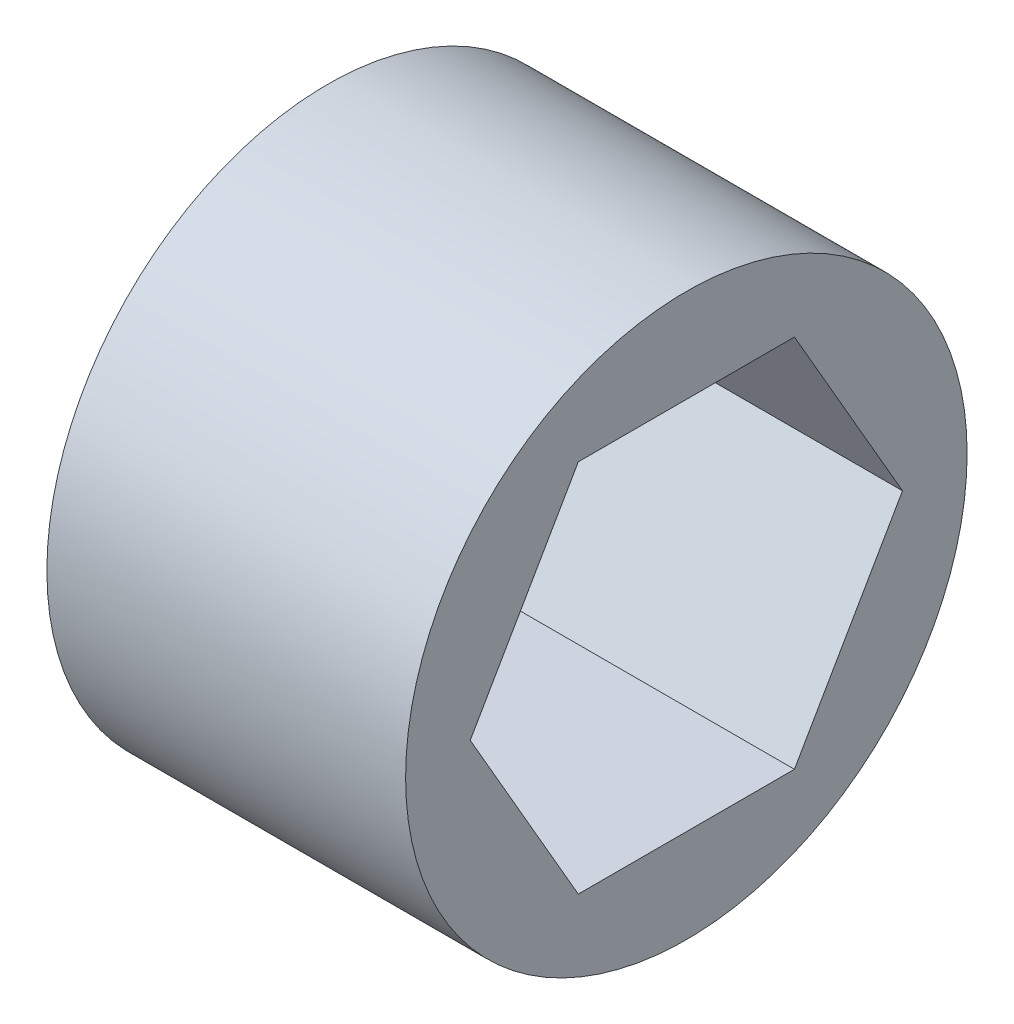
ISO-10303-21;
HEADER;
FILE_DESCRIPTION(('STEP AP214'),'2;1');
FILE_NAME('part.step','',(''),(''),'','','');
FILE_SCHEMA(('AUTOMOTIVE_DESIGN { 1 0 10303 214 1 1 1 1 }'));
ENDSEC;
DATA;
#1=APPLICATION_CONTEXT('core data for automotive mechanical design processes');
#2=APPLICATION_PROTOCOL_DEFINITION('international standard','automotive_design',2000,#1);
#3=PRODUCT_CONTEXT('',#1,'mechanical');
#4=PRODUCT('Part','Part','',(#3));
#5=PRODUCT_RELATED_PRODUCT_CATEGORY('part','',(#4));
#6=PRODUCT_DEFINITION_FORMATION('','',#4);
#7=PRODUCT_DEFINITION_CONTEXT('part definition',#1,'design');
#8=PRODUCT_DEFINITION('design','',#6,#7);
#9=PRODUCT_DEFINITION_SHAPE('','',#8);
#10=(LENGTH_UNIT() NAMED_UNIT(*) SI_UNIT(.MILLI.,.METRE.));
#11=(NAMED_UNIT(*) PLANE_ANGLE_UNIT() SI_UNIT($,.RADIAN.));
#12=(NAMED_UNIT(*) SI_UNIT($,.STERADIAN.) SOLID_ANGLE_UNIT());
#13=UNCERTAINTY_MEASURE_WITH_UNIT(LENGTH_MEASURE(1.E-05),#10,'distance_accuracy_value','');
#14=(GEOMETRIC_REPRESENTATION_CONTEXT(3) GLOBAL_UNCERTAINTY_ASSIGNED_CONTEXT((#13)) GLOBAL_UNIT_ASSIGNED_CONTEXT((#10,
#11,#12)) REPRESENTATION_CONTEXT('',''));
#15=CARTESIAN_POINT('',(0.,0.,0.));
#16=DIRECTION('',(0.,0.,1.));
#17=DIRECTION('',(1.,0.,0.));
#18=AXIS2_PLACEMENT_3D('',#15,#16,#17);
#19=CARTESIAN_POINT('',(6.085,0.,0.));
#20=DIRECTION('',(1.,0.,0.));
#21=DIRECTION('',(0.,0.,-1.));
#22=AXIS2_PLACEMENT_3D('',#19,#20,#21);
#23=PLANE('',#22);
#24=CARTESIAN_POINT('',(6.085,0.,0.));
#25=DIRECTION('',(1.,0.,0.));
#26=DIRECTION('',(0.,0.,-1.));
#27=AXIS2_PLACEMENT_3D('',#24,#25,#26);
#28=CIRCLE('',#27,9.525);
#29=CARTESIAN_POINT('',(6.085,0.,-9.525));
#30=VERTEX_POINT('',#29);
#31=EDGE_CURVE('E11',#30,#30,#28,.T.);
#32=ORIENTED_EDGE('',*,*,#31,.T.);
#33=EDGE_LOOP('',(#32));
#34=FACE_BOUND('',#33,.T.);
#35=DIRECTION('',(0.,0.866025403784438,0.500000000000001));
#36=VECTOR('',#35,1.);
#37=CARTESIAN_POINT('',(6.085,0.,-7.33234841870825));
#38=LINE('',#37,#36);
#39=CARTESIAN_POINT('',(6.085,0.,-7.33234841870825));
#40=VERTEX_POINT('',#39);
#41=CARTESIAN_POINT('',(6.085,6.35000000000001,-3.66617420935411));
#42=VERTEX_POINT('',#41);
#43=EDGE_CURVE('E100',#40,#42,#38,.T.);
#44=ORIENTED_EDGE('',*,*,#43,.F.);
#45=DIRECTION('',(0.,0.866025403784441,-0.499999999999995));
#46=VECTOR('',#45,1.);
#47=CARTESIAN_POINT('',(6.085,-6.34999999999996,-3.6661742093542));
#48=LINE('',#47,#46);
#49=CARTESIAN_POINT('',(6.085,-6.34999999999996,-3.6661742093542));
#50=VERTEX_POINT('',#49);
#51=EDGE_CURVE('E92',#50,#40,#48,.T.);
#52=ORIENTED_EDGE('',*,*,#51,.F.);
#53=DIRECTION('',(0.,0.,-1.));
#54=VECTOR('',#53,1.);
#55=CARTESIAN_POINT('',(6.085,-6.35000000000004,3.66617420935407));
#56=LINE('',#55,#54);
#57=CARTESIAN_POINT('',(6.085,-6.35000000000004,3.66617420935407));
#58=VERTEX_POINT('',#57);
#59=EDGE_CURVE('E120',#58,#50,#56,.T.);
#60=ORIENTED_EDGE('',*,*,#59,.F.);
#61=DIRECTION('',(0.,-0.866025403784435,-0.500000000000007));
#62=VECTOR('',#61,1.);
#63=CARTESIAN_POINT('',(6.085,0.,7.33234841870825));
#64=LINE('',#63,#62);
#65=CARTESIAN_POINT('',(6.085,0.,7.33234841870825));
#66=VERTEX_POINT('',#65);
#67=EDGE_CURVE('E118',#66,#58,#64,.T.);
#68=ORIENTED_EDGE('',*,*,#67,.F.);
#69=DIRECTION('',(0.,-0.866025403784441,0.499999999999995));
#70=VECTOR('',#69,1.);
#71=CARTESIAN_POINT('',(6.085,6.34999999999999,3.66617420935415));
#72=LINE('',#71,#70);
#73=CARTESIAN_POINT('',(6.085,6.34999999999999,3.66617420935415));
#74=VERTEX_POINT('',#73);
#75=EDGE_CURVE('E114',#74,#66,#72,.T.);
#76=ORIENTED_EDGE('',*,*,#75,.F.);
#77=DIRECTION('',(0.,0.,1.));
#78=VECTOR('',#77,1.);
#79=CARTESIAN_POINT('',(6.085,6.35000000000001,-3.66617420935411));
#80=LINE('',#79,#78);
#81=EDGE_CURVE('E112',#42,#74,#80,.T.);
#82=ORIENTED_EDGE('',*,*,#81,.F.);
#83=EDGE_LOOP('',(#44,#52,#60,#68,#76,#82));
#84=FACE_BOUND('',#83,.T.);
#85=ADVANCED_FACE('F39',(#34,#84),#23,.T.);
#86=CARTESIAN_POINT('',(-6.085,0.,0.));
#87=DIRECTION('',(1.,0.,0.));
#88=DIRECTION('',(0.,0.,-1.));
#89=AXIS2_PLACEMENT_3D('',#86,#87,#88);
#90=PLANE('',#89);
#91=CARTESIAN_POINT('',(-6.085,0.,0.));
#92=DIRECTION('',(1.,0.,0.));
#93=DIRECTION('',(0.,0.,-1.));
#94=AXIS2_PLACEMENT_3D('',#91,#92,#93);
#95=CIRCLE('',#94,9.525);
#96=CARTESIAN_POINT('',(-6.085,0.,-9.525));
#97=VERTEX_POINT('',#96);
#98=EDGE_CURVE('E43',#97,#97,#95,.T.);
#99=ORIENTED_EDGE('',*,*,#98,.F.);
#100=EDGE_LOOP('',(#99));
#101=FACE_BOUND('',#100,.T.);
#102=DIRECTION('',(0.,0.866025403784441,-0.499999999999995));
#103=VECTOR('',#102,1.);
#104=CARTESIAN_POINT('',(-6.085,-6.34999999999996,-3.6661742093542));
#105=LINE('',#104,#103);
#106=CARTESIAN_POINT('',(-6.085,-6.34999999999996,-3.6661742093542));
#107=VERTEX_POINT('',#106);
#108=CARTESIAN_POINT('',(-6.085,0.,-7.33234841870825));
#109=VERTEX_POINT('',#108);
#110=EDGE_CURVE('E62',#107,#109,#105,.T.);
#111=ORIENTED_EDGE('',*,*,#110,.T.);
#112=DIRECTION('',(0.,0.866025403784438,0.500000000000001));
#113=VECTOR('',#112,1.);
#114=CARTESIAN_POINT('',(-6.085,0.,-7.33234841870825));
#115=LINE('',#114,#113);
#116=CARTESIAN_POINT('',(-6.085,6.35000000000001,-3.66617420935411));
#117=VERTEX_POINT('',#116);
#118=EDGE_CURVE('E107',#109,#117,#115,.T.);
#119=ORIENTED_EDGE('',*,*,#118,.T.);
#120=DIRECTION('',(0.,0.,1.));
#121=VECTOR('',#120,1.);
#122=CARTESIAN_POINT('',(-6.085,6.35000000000001,-3.66617420935411));
#123=LINE('',#122,#121);
#124=CARTESIAN_POINT('',(-6.085,6.34999999999999,3.66617420935415));
#125=VERTEX_POINT('',#124);
#126=EDGE_CURVE('E124',#117,#125,#123,.T.);
#127=ORIENTED_EDGE('',*,*,#126,.T.);
#128=DIRECTION('',(0.,-0.866025403784441,0.499999999999995));
#129=VECTOR('',#128,1.);
#130=CARTESIAN_POINT('',(-6.085,6.34999999999999,3.66617420935415));
#131=LINE('',#130,#129);
#132=CARTESIAN_POINT('',(-6.085,0.,7.33234841870825));
#133=VERTEX_POINT('',#132);
#134=EDGE_CURVE('E127',#125,#133,#131,.T.);
#135=ORIENTED_EDGE('',*,*,#134,.T.);
#136=DIRECTION('',(0.,-0.866025403784435,-0.500000000000007));
#137=VECTOR('',#136,1.);
#138=CARTESIAN_POINT('',(-6.085,0.,7.33234841870825));
#139=LINE('',#138,#137);
#140=CARTESIAN_POINT('',(-6.085,-6.35000000000004,3.66617420935407));
#141=VERTEX_POINT('',#140);
#142=EDGE_CURVE('E130',#133,#141,#139,.T.);
#143=ORIENTED_EDGE('',*,*,#142,.T.);
#144=DIRECTION('',(0.,0.,-1.));
#145=VECTOR('',#144,1.);
#146=CARTESIAN_POINT('',(-6.085,-6.35000000000004,3.66617420935407));
#147=LINE('',#146,#145);
#148=EDGE_CURVE('E101',#141,#107,#147,.T.);
#149=ORIENTED_EDGE('',*,*,#148,.T.);
#150=EDGE_LOOP('',(#111,#119,#127,#135,#143,#149));
#151=FACE_BOUND('',#150,.T.);
#152=ADVANCED_FACE('F147',(#101,#151),#90,.F.);
#153=CARTESIAN_POINT('',(6.085,0.,0.));
#154=DIRECTION('',(-1.,0.,0.));
#155=DIRECTION('',(0.,0.,1.));
#156=AXIS2_PLACEMENT_3D('',#153,#154,#155);
#157=CYLINDRICAL_SURFACE('',#156,9.525);
#158=ORIENTED_EDGE('',*,*,#31,.F.);
#159=EDGE_LOOP('',(#158));
#160=FACE_BOUND('',#159,.T.);
#161=ORIENTED_EDGE('',*,*,#98,.T.);
#162=EDGE_LOOP('',(#161));
#163=FACE_BOUND('',#162,.T.);
#164=ADVANCED_FACE('F41',(#160,#163),#157,.T.);
#165=CARTESIAN_POINT('',(6.085,-6.34999999999996,-3.6661742093542));
#166=DIRECTION('',(0.,0.499999999999995,0.866025403784442));
#167=DIRECTION('',(0.,-0.866025403784442,0.499999999999995));
#168=AXIS2_PLACEMENT_3D('',#165,#166,#167);
#169=PLANE('',#168);
#170=ORIENTED_EDGE('',*,*,#110,.F.);
#171=DIRECTION('',(-1.,0.,0.));
#172=VECTOR('',#171,1.);
#173=CARTESIAN_POINT('',(6.085,-6.34999999999996,-3.6661742093542));
#174=LINE('',#173,#172);
#175=EDGE_CURVE('E96',#50,#107,#174,.T.);
#176=ORIENTED_EDGE('',*,*,#175,.F.);
#177=ORIENTED_EDGE('',*,*,#51,.T.);
#178=DIRECTION('',(-1.,0.,0.));
#179=VECTOR('',#178,1.);
#180=CARTESIAN_POINT('',(6.085,0.,-7.33234841870825));
#181=LINE('',#180,#179);
#182=EDGE_CURVE('E95',#40,#109,#181,.T.);
#183=ORIENTED_EDGE('',*,*,#182,.T.);
#184=EDGE_LOOP('',(#170,#176,#177,#183));
#185=FACE_BOUND('',#184,.T.);
#186=ADVANCED_FACE('F94',(#185),#169,.T.);
#187=CARTESIAN_POINT('',(6.085,0.,-7.33234841870825));
#188=DIRECTION('',(0.,-0.500000000000001,0.866025403784438));
#189=DIRECTION('',(0.,-0.866025403784438,-0.500000000000001));
#190=AXIS2_PLACEMENT_3D('',#187,#188,#189);
#191=PLANE('',#190);
#192=ORIENTED_EDGE('',*,*,#118,.F.);
#193=ORIENTED_EDGE('',*,*,#182,.F.);
#194=ORIENTED_EDGE('',*,*,#43,.T.);
#195=DIRECTION('',(-1.,0.,0.));
#196=VECTOR('',#195,1.);
#197=CARTESIAN_POINT('',(6.085,6.35000000000001,-3.66617420935411));
#198=LINE('',#197,#196);
#199=EDGE_CURVE('E108',#42,#117,#198,.T.);
#200=ORIENTED_EDGE('',*,*,#199,.T.);
#201=EDGE_LOOP('',(#192,#193,#194,#200));
#202=FACE_BOUND('',#201,.T.);
#203=ADVANCED_FACE('F104',(#202),#191,.T.);
#204=CARTESIAN_POINT('',(6.085,6.35000000000001,-3.66617420935411));
#205=DIRECTION('',(0.,-1.,0.));
#206=DIRECTION('',(0.,0.,-1.));
#207=AXIS2_PLACEMENT_3D('',#204,#205,#206);
#208=PLANE('',#207);
#209=ORIENTED_EDGE('',*,*,#126,.F.);
#210=ORIENTED_EDGE('',*,*,#199,.F.);
#211=ORIENTED_EDGE('',*,*,#81,.T.);
#212=DIRECTION('',(-1.,0.,0.));
#213=VECTOR('',#212,1.);
#214=CARTESIAN_POINT('',(6.085,6.34999999999999,3.66617420935415));
#215=LINE('',#214,#213);
#216=EDGE_CURVE('E139',#74,#125,#215,.T.);
#217=ORIENTED_EDGE('',*,*,#216,.T.);
#218=EDGE_LOOP('',(#209,#210,#211,#217));
#219=FACE_BOUND('',#218,.T.);
#220=ADVANCED_FACE('F143',(#219),#208,.T.);
#221=CARTESIAN_POINT('',(6.085,6.34999999999999,3.66617420935415));
#222=DIRECTION('',(0.,-0.499999999999995,-0.866025403784442));
#223=DIRECTION('',(0.,0.866025403784442,-0.499999999999995));
#224=AXIS2_PLACEMENT_3D('',#221,#222,#223);
#225=PLANE('',#224);
#226=ORIENTED_EDGE('',*,*,#134,.F.);
#227=ORIENTED_EDGE('',*,*,#216,.F.);
#228=ORIENTED_EDGE('',*,*,#75,.T.);
#229=DIRECTION('',(-1.,0.,0.));
#230=VECTOR('',#229,1.);
#231=CARTESIAN_POINT('',(6.085,0.,7.33234841870825));
#232=LINE('',#231,#230);
#233=EDGE_CURVE('E137',#66,#133,#232,.T.);
#234=ORIENTED_EDGE('',*,*,#233,.T.);
#235=EDGE_LOOP('',(#226,#227,#228,#234));
#236=FACE_BOUND('',#235,.T.);
#237=ADVANCED_FACE('F155',(#236),#225,.T.);
#238=CARTESIAN_POINT('',(6.085,0.,7.33234841870825));
#239=DIRECTION('',(0.,0.500000000000007,-0.866025403784435));
#240=DIRECTION('',(0.,0.866025403784435,0.500000000000007));
#241=AXIS2_PLACEMENT_3D('',#238,#239,#240);
#242=PLANE('',#241);
#243=ORIENTED_EDGE('',*,*,#142,.F.);
#244=ORIENTED_EDGE('',*,*,#233,.F.);
#245=ORIENTED_EDGE('',*,*,#67,.T.);
#246=DIRECTION('',(-1.,0.,0.));
#247=VECTOR('',#246,1.);
#248=CARTESIAN_POINT('',(6.085,-6.35000000000004,3.66617420935407));
#249=LINE('',#248,#247);
#250=EDGE_CURVE('E54',#58,#141,#249,.T.);
#251=ORIENTED_EDGE('',*,*,#250,.T.);
#252=EDGE_LOOP('',(#243,#244,#245,#251));
#253=FACE_BOUND('',#252,.T.);
#254=ADVANCED_FACE('F153',(#253),#242,.T.);
#255=CARTESIAN_POINT('',(6.085,-6.35000000000004,3.66617420935407));
#256=DIRECTION('',(0.,1.,0.));
#257=DIRECTION('',(0.,0.,1.));
#258=AXIS2_PLACEMENT_3D('',#255,#256,#257);
#259=PLANE('',#258);
#260=ORIENTED_EDGE('',*,*,#148,.F.);
#261=ORIENTED_EDGE('',*,*,#250,.F.);
#262=ORIENTED_EDGE('',*,*,#59,.T.);
#263=ORIENTED_EDGE('',*,*,#175,.T.);
#264=EDGE_LOOP('',(#260,#261,#262,#263));
#265=FACE_BOUND('',#264,.T.);
#266=ADVANCED_FACE('F149',(#265),#259,.T.);
#267=CLOSED_SHELL('',(#85,#152,#164,#186,#203,#220,#237,#254,#266));
#268=MANIFOLD_SOLID_BREP('B2',#267);
#269=ADVANCED_BREP_SHAPE_REPRESENTATION('',(#18,#268),#14);
#270=SHAPE_DEFINITION_REPRESENTATION(#9,#269);
ENDSEC;
END-ISO-10303-21;
